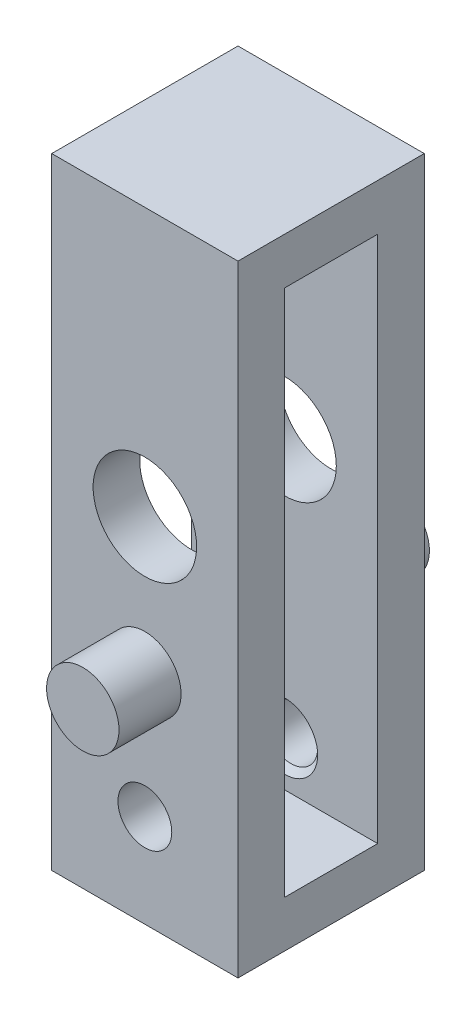
ISO-10303-21;
HEADER;
FILE_DESCRIPTION(('STEP AP214'),'2;1');
FILE_NAME('part.step','',(''),(''),'','','');
FILE_SCHEMA(('AUTOMOTIVE_DESIGN { 1 0 10303 214 1 1 1 1 }'));
ENDSEC;
DATA;
#1=APPLICATION_CONTEXT('core data for automotive mechanical design processes');
#2=APPLICATION_PROTOCOL_DEFINITION('international standard','automotive_design',2000,#1);
#3=PRODUCT_CONTEXT('',#1,'mechanical');
#4=PRODUCT('Part','Part','',(#3));
#5=PRODUCT_RELATED_PRODUCT_CATEGORY('part','',(#4));
#6=PRODUCT_DEFINITION_FORMATION('','',#4);
#7=PRODUCT_DEFINITION_CONTEXT('part definition',#1,'design');
#8=PRODUCT_DEFINITION('design','',#6,#7);
#9=PRODUCT_DEFINITION_SHAPE('','',#8);
#10=(LENGTH_UNIT() NAMED_UNIT(*) SI_UNIT(.MILLI.,.METRE.));
#11=(NAMED_UNIT(*) PLANE_ANGLE_UNIT() SI_UNIT($,.RADIAN.));
#12=(NAMED_UNIT(*) SI_UNIT($,.STERADIAN.) SOLID_ANGLE_UNIT());
#13=UNCERTAINTY_MEASURE_WITH_UNIT(LENGTH_MEASURE(1.E-05),#10,'distance_accuracy_value','');
#14=(GEOMETRIC_REPRESENTATION_CONTEXT(3) GLOBAL_UNCERTAINTY_ASSIGNED_CONTEXT((#13)) GLOBAL_UNIT_ASSIGNED_CONTEXT((#10,
#11,#12)) REPRESENTATION_CONTEXT('',''));
#15=CARTESIAN_POINT('',(0.,0.,0.));
#16=DIRECTION('',(0.,0.,1.));
#17=DIRECTION('',(1.,0.,0.));
#18=AXIS2_PLACEMENT_3D('',#15,#16,#17);
#19=CARTESIAN_POINT('',(45.,300.,45.));
#20=DIRECTION('',(-1.,0.,0.));
#21=DIRECTION('',(0.,0.,1.));
#22=AXIS2_PLACEMENT_3D('',#19,#20,#21);
#23=PLANE('',#22);
#24=DIRECTION('',(0.,0.,-1.));
#25=VECTOR('',#24,1.);
#26=CARTESIAN_POINT('',(45.,22.5,22.5));
#27=LINE('',#26,#25);
#28=CARTESIAN_POINT('',(45.,22.5,22.5));
#29=VERTEX_POINT('',#28);
#30=CARTESIAN_POINT('',(45.,22.5,-22.5));
#31=VERTEX_POINT('',#30);
#32=EDGE_CURVE('E145',#29,#31,#27,.T.);
#33=ORIENTED_EDGE('',*,*,#32,.F.);
#34=DIRECTION('',(0.,-1.,0.));
#35=VECTOR('',#34,1.);
#36=CARTESIAN_POINT('',(45.,277.5,22.5));
#37=LINE('',#36,#35);
#38=CARTESIAN_POINT('',(45.,277.5,22.5));
#39=VERTEX_POINT('',#38);
#40=EDGE_CURVE('E58',#39,#29,#37,.T.);
#41=ORIENTED_EDGE('',*,*,#40,.F.);
#42=DIRECTION('',(0.,0.,1.));
#43=VECTOR('',#42,1.);
#44=CARTESIAN_POINT('',(45.,277.5,-22.5));
#45=LINE('',#44,#43);
#46=CARTESIAN_POINT('',(45.,277.5,-22.5));
#47=VERTEX_POINT('',#46);
#48=EDGE_CURVE('E129',#47,#39,#45,.T.);
#49=ORIENTED_EDGE('',*,*,#48,.F.);
#50=DIRECTION('',(0.,1.,0.));
#51=VECTOR('',#50,1.);
#52=CARTESIAN_POINT('',(45.,22.5,-22.5));
#53=LINE('',#52,#51);
#54=EDGE_CURVE('E133',#31,#47,#53,.T.);
#55=ORIENTED_EDGE('',*,*,#54,.F.);
#56=EDGE_LOOP('',(#33,#41,#49,#55));
#57=FACE_BOUND('',#56,.T.);
#58=DIRECTION('',(0.,0.,-1.));
#59=VECTOR('',#58,1.);
#60=CARTESIAN_POINT('',(45.,0.,45.));
#61=LINE('',#60,#59);
#62=CARTESIAN_POINT('',(45.,0.,45.));
#63=VERTEX_POINT('',#62);
#64=CARTESIAN_POINT('',(45.,0.,-45.));
#65=VERTEX_POINT('',#64);
#66=EDGE_CURVE('E154',#63,#65,#61,.T.);
#67=ORIENTED_EDGE('',*,*,#66,.T.);
#68=DIRECTION('',(0.,-1.,0.));
#69=VECTOR('',#68,1.);
#70=CARTESIAN_POINT('',(45.,300.,-45.));
#71=LINE('',#70,#69);
#72=CARTESIAN_POINT('',(45.,300.,-45.));
#73=VERTEX_POINT('',#72);
#74=EDGE_CURVE('E197',#73,#65,#71,.T.);
#75=ORIENTED_EDGE('',*,*,#74,.F.);
#76=DIRECTION('',(0.,0.,-1.));
#77=VECTOR('',#76,1.);
#78=CARTESIAN_POINT('',(45.,300.,45.));
#79=LINE('',#78,#77);
#80=CARTESIAN_POINT('',(45.,300.,45.));
#81=VERTEX_POINT('',#80);
#82=EDGE_CURVE('E160',#81,#73,#79,.T.);
#83=ORIENTED_EDGE('',*,*,#82,.F.);
#84=DIRECTION('',(0.,-1.,0.));
#85=VECTOR('',#84,1.);
#86=CARTESIAN_POINT('',(45.,300.,45.));
#87=LINE('',#86,#85);
#88=EDGE_CURVE('E174',#81,#63,#87,.T.);
#89=ORIENTED_EDGE('',*,*,#88,.T.);
#90=EDGE_LOOP('',(#67,#75,#83,#89));
#91=FACE_BOUND('',#90,.T.);
#92=ADVANCED_FACE('F41',(#57,#91),#23,.F.);
#93=CARTESIAN_POINT('',(-45.,300.,-45.));
#94=DIRECTION('',(0.,0.,1.));
#95=DIRECTION('',(1.,0.,0.));
#96=AXIS2_PLACEMENT_3D('',#93,#94,#95);
#97=PLANE('',#96);
#98=CARTESIAN_POINT('',(0.,105.,-45.));
#99=DIRECTION('',(0.,0.,1.));
#100=DIRECTION('',(1.,0.,0.));
#101=AXIS2_PLACEMENT_3D('',#98,#99,#100);
#102=CIRCLE('',#101,17.5);
#103=CARTESIAN_POINT('',(17.5,105.,-45.));
#104=VERTEX_POINT('',#103);
#105=EDGE_CURVE('E300',#104,#104,#102,.T.);
#106=ORIENTED_EDGE('',*,*,#105,.T.);
#107=EDGE_LOOP('',(#106));
#108=FACE_BOUND('',#107,.T.);
#109=CARTESIAN_POINT('',(0.,45.,-45.));
#110=DIRECTION('',(0.,0.,1.));
#111=DIRECTION('',(1.,0.,0.));
#112=AXIS2_PLACEMENT_3D('',#109,#110,#111);
#113=CIRCLE('',#112,13.);
#114=CARTESIAN_POINT('',(13.,45.,-45.));
#115=VERTEX_POINT('',#114);
#116=EDGE_CURVE('E285',#115,#115,#113,.T.);
#117=ORIENTED_EDGE('',*,*,#116,.T.);
#118=EDGE_LOOP('',(#117));
#119=FACE_BOUND('',#118,.T.);
#120=CARTESIAN_POINT('',(0.,170.5,-45.));
#121=DIRECTION('',(0.,0.,1.));
#122=DIRECTION('',(1.,0.,0.));
#123=AXIS2_PLACEMENT_3D('',#120,#121,#122);
#124=CIRCLE('',#123,25.);
#125=CARTESIAN_POINT('',(25.,170.5,-45.));
#126=VERTEX_POINT('',#125);
#127=EDGE_CURVE('E206',#126,#126,#124,.T.);
#128=ORIENTED_EDGE('',*,*,#127,.T.);
#129=EDGE_LOOP('',(#128));
#130=FACE_BOUND('',#129,.T.);
#131=DIRECTION('',(-1.,0.,0.));
#132=VECTOR('',#131,1.);
#133=CARTESIAN_POINT('',(-45.,0.,-45.));
#134=LINE('',#133,#132);
#135=CARTESIAN_POINT('',(-45.,0.,-45.));
#136=VERTEX_POINT('',#135);
#137=EDGE_CURVE('E178',#65,#136,#134,.T.);
#138=ORIENTED_EDGE('',*,*,#137,.T.);
#139=DIRECTION('',(0.,-1.,0.));
#140=VECTOR('',#139,1.);
#141=CARTESIAN_POINT('',(-45.,300.,-45.));
#142=LINE('',#141,#140);
#143=CARTESIAN_POINT('',(-45.,300.,-45.));
#144=VERTEX_POINT('',#143);
#145=EDGE_CURVE('E193',#144,#136,#142,.T.);
#146=ORIENTED_EDGE('',*,*,#145,.F.);
#147=DIRECTION('',(-1.,0.,0.));
#148=VECTOR('',#147,1.);
#149=CARTESIAN_POINT('',(-45.,300.,-45.));
#150=LINE('',#149,#148);
#151=EDGE_CURVE('E164',#73,#144,#150,.T.);
#152=ORIENTED_EDGE('',*,*,#151,.F.);
#153=ORIENTED_EDGE('',*,*,#74,.T.);
#154=EDGE_LOOP('',(#138,#146,#152,#153));
#155=FACE_BOUND('',#154,.T.);
#156=ADVANCED_FACE('F251',(#108,#119,#130,#155),#97,.F.);
#157=CARTESIAN_POINT('',(-45.,300.,45.));
#158=DIRECTION('',(1.,0.,0.));
#159=DIRECTION('',(0.,0.,-1.));
#160=AXIS2_PLACEMENT_3D('',#157,#158,#159);
#161=PLANE('',#160);
#162=DIRECTION('',(0.,0.,1.));
#163=VECTOR('',#162,1.);
#164=CARTESIAN_POINT('',(-45.,277.5,-22.5));
#165=LINE('',#164,#163);
#166=CARTESIAN_POINT('',(-45.,277.5,-22.5));
#167=VERTEX_POINT('',#166);
#168=CARTESIAN_POINT('',(-45.,277.5,22.5));
#169=VERTEX_POINT('',#168);
#170=EDGE_CURVE('E117',#167,#169,#165,.T.);
#171=ORIENTED_EDGE('',*,*,#170,.T.);
#172=DIRECTION('',(0.,-1.,0.));
#173=VECTOR('',#172,1.);
#174=CARTESIAN_POINT('',(-45.,277.5,22.5));
#175=LINE('',#174,#173);
#176=CARTESIAN_POINT('',(-45.,22.5,22.5));
#177=VERTEX_POINT('',#176);
#178=EDGE_CURVE('E110',#169,#177,#175,.T.);
#179=ORIENTED_EDGE('',*,*,#178,.T.);
#180=DIRECTION('',(0.,0.,-1.));
#181=VECTOR('',#180,1.);
#182=CARTESIAN_POINT('',(-45.,22.5,22.5));
#183=LINE('',#182,#181);
#184=CARTESIAN_POINT('',(-45.,22.5,-22.5));
#185=VERTEX_POINT('',#184);
#186=EDGE_CURVE('E120',#177,#185,#183,.T.);
#187=ORIENTED_EDGE('',*,*,#186,.T.);
#188=DIRECTION('',(0.,1.,0.));
#189=VECTOR('',#188,1.);
#190=CARTESIAN_POINT('',(-45.,22.5,-22.5));
#191=LINE('',#190,#189);
#192=EDGE_CURVE('E66',#185,#167,#191,.T.);
#193=ORIENTED_EDGE('',*,*,#192,.T.);
#194=EDGE_LOOP('',(#171,#179,#187,#193));
#195=FACE_BOUND('',#194,.T.);
#196=DIRECTION('',(0.,0.,1.));
#197=VECTOR('',#196,1.);
#198=CARTESIAN_POINT('',(-45.,0.,45.));
#199=LINE('',#198,#197);
#200=CARTESIAN_POINT('',(-45.,0.,45.));
#201=VERTEX_POINT('',#200);
#202=EDGE_CURVE('E181',#136,#201,#199,.T.);
#203=ORIENTED_EDGE('',*,*,#202,.T.);
#204=DIRECTION('',(0.,-1.,0.));
#205=VECTOR('',#204,1.);
#206=CARTESIAN_POINT('',(-45.,300.,45.));
#207=LINE('',#206,#205);
#208=CARTESIAN_POINT('',(-45.,300.,45.));
#209=VERTEX_POINT('',#208);
#210=EDGE_CURVE('E189',#209,#201,#207,.T.);
#211=ORIENTED_EDGE('',*,*,#210,.F.);
#212=DIRECTION('',(0.,0.,1.));
#213=VECTOR('',#212,1.);
#214=CARTESIAN_POINT('',(-45.,300.,45.));
#215=LINE('',#214,#213);
#216=EDGE_CURVE('E168',#144,#209,#215,.T.);
#217=ORIENTED_EDGE('',*,*,#216,.F.);
#218=ORIENTED_EDGE('',*,*,#145,.T.);
#219=EDGE_LOOP('',(#203,#211,#217,#218));
#220=FACE_BOUND('',#219,.T.);
#221=ADVANCED_FACE('F125',(#195,#220),#161,.F.);
#222=CARTESIAN_POINT('',(-45.,300.,45.));
#223=DIRECTION('',(0.,0.,-1.));
#224=DIRECTION('',(-1.,0.,0.));
#225=AXIS2_PLACEMENT_3D('',#222,#223,#224);
#226=PLANE('',#225);
#227=CARTESIAN_POINT('',(0.,105.,45.));
#228=DIRECTION('',(0.,0.,-1.));
#229=DIRECTION('',(-1.,0.,0.));
#230=AXIS2_PLACEMENT_3D('',#227,#228,#229);
#231=CIRCLE('',#230,17.5);
#232=CARTESIAN_POINT('',(-17.5,105.,45.));
#233=VERTEX_POINT('',#232);
#234=EDGE_CURVE('E11',#233,#233,#231,.F.);
#235=ORIENTED_EDGE('',*,*,#234,.F.);
#236=EDGE_LOOP('',(#235));
#237=FACE_BOUND('',#236,.T.);
#238=CARTESIAN_POINT('',(0.,45.,45.));
#239=DIRECTION('',(0.,0.,1.));
#240=DIRECTION('',(1.,0.,0.));
#241=AXIS2_PLACEMENT_3D('',#238,#239,#240);
#242=CIRCLE('',#241,13.);
#243=CARTESIAN_POINT('',(13.,45.,45.));
#244=VERTEX_POINT('',#243);
#245=EDGE_CURVE('E288',#244,#244,#242,.T.);
#246=ORIENTED_EDGE('',*,*,#245,.F.);
#247=EDGE_LOOP('',(#246));
#248=FACE_BOUND('',#247,.T.);
#249=CARTESIAN_POINT('',(0.,170.5,45.));
#250=DIRECTION('',(0.,0.,1.));
#251=DIRECTION('',(1.,0.,0.));
#252=AXIS2_PLACEMENT_3D('',#249,#250,#251);
#253=CIRCLE('',#252,25.);
#254=CARTESIAN_POINT('',(25.,170.5,45.));
#255=VERTEX_POINT('',#254);
#256=EDGE_CURVE('E281',#255,#255,#253,.T.);
#257=ORIENTED_EDGE('',*,*,#256,.F.);
#258=EDGE_LOOP('',(#257));
#259=FACE_BOUND('',#258,.T.);
#260=DIRECTION('',(1.,0.,0.));
#261=VECTOR('',#260,1.);
#262=CARTESIAN_POINT('',(-45.,0.,45.));
#263=LINE('',#262,#261);
#264=EDGE_CURVE('E165',#201,#63,#263,.T.);
#265=ORIENTED_EDGE('',*,*,#264,.T.);
#266=ORIENTED_EDGE('',*,*,#88,.F.);
#267=DIRECTION('',(1.,0.,0.));
#268=VECTOR('',#267,1.);
#269=CARTESIAN_POINT('',(-45.,300.,45.));
#270=LINE('',#269,#268);
#271=EDGE_CURVE('E171',#209,#81,#270,.T.);
#272=ORIENTED_EDGE('',*,*,#271,.F.);
#273=ORIENTED_EDGE('',*,*,#210,.T.);
#274=EDGE_LOOP('',(#265,#266,#272,#273));
#275=FACE_BOUND('',#274,.T.);
#276=ADVANCED_FACE('F335',(#237,#248,#259,#275),#226,.F.);
#277=CARTESIAN_POINT('',(0.,300.,0.));
#278=DIRECTION('',(0.,-1.,0.));
#279=DIRECTION('',(0.,0.,-1.));
#280=AXIS2_PLACEMENT_3D('',#277,#278,#279);
#281=PLANE('',#280);
#282=ORIENTED_EDGE('',*,*,#82,.T.);
#283=ORIENTED_EDGE('',*,*,#151,.T.);
#284=ORIENTED_EDGE('',*,*,#216,.T.);
#285=ORIENTED_EDGE('',*,*,#271,.T.);
#286=EDGE_LOOP('',(#282,#283,#284,#285));
#287=FACE_BOUND('',#286,.T.);
#288=ADVANCED_FACE('F338',(#287),#281,.F.);
#289=CARTESIAN_POINT('',(0.,0.,0.));
#290=DIRECTION('',(0.,-1.,0.));
#291=DIRECTION('',(0.,0.,-1.));
#292=AXIS2_PLACEMENT_3D('',#289,#290,#291);
#293=PLANE('',#292);
#294=ORIENTED_EDGE('',*,*,#66,.F.);
#295=ORIENTED_EDGE('',*,*,#264,.F.);
#296=ORIENTED_EDGE('',*,*,#202,.F.);
#297=ORIENTED_EDGE('',*,*,#137,.F.);
#298=EDGE_LOOP('',(#294,#295,#296,#297));
#299=FACE_BOUND('',#298,.T.);
#300=ADVANCED_FACE('F246',(#299),#293,.T.);
#301=CARTESIAN_POINT('',(-45.,277.5,22.5));
#302=DIRECTION('',(0.,0.,1.));
#303=DIRECTION('',(1.,0.,0.));
#304=AXIS2_PLACEMENT_3D('',#301,#302,#303);
#305=PLANE('',#304);
#306=CARTESIAN_POINT('',(0.,45.,22.5));
#307=DIRECTION('',(0.,0.,1.));
#308=DIRECTION('',(1.,0.,0.));
#309=AXIS2_PLACEMENT_3D('',#306,#307,#308);
#310=CIRCLE('',#309,15.9999999999998);
#311=CARTESIAN_POINT('',(15.9999999999998,45.,22.5));
#312=VERTEX_POINT('',#311);
#313=EDGE_CURVE('E201',#312,#312,#310,.T.);
#314=ORIENTED_EDGE('',*,*,#313,.T.);
#315=EDGE_LOOP('',(#314));
#316=FACE_BOUND('',#315,.T.);
#317=CARTESIAN_POINT('',(0.,170.5,22.5));
#318=DIRECTION('',(0.,0.,1.));
#319=DIRECTION('',(1.,0.,0.));
#320=AXIS2_PLACEMENT_3D('',#317,#318,#319);
#321=CIRCLE('',#320,25.);
#322=CARTESIAN_POINT('',(25.,170.5,22.5));
#323=VERTEX_POINT('',#322);
#324=EDGE_CURVE('E136',#323,#323,#321,.T.);
#325=ORIENTED_EDGE('',*,*,#324,.T.);
#326=EDGE_LOOP('',(#325));
#327=FACE_BOUND('',#326,.T.);
#328=ORIENTED_EDGE('',*,*,#40,.T.);
#329=DIRECTION('',(1.,0.,0.));
#330=VECTOR('',#329,1.);
#331=CARTESIAN_POINT('',(-45.,22.5,22.5));
#332=LINE('',#331,#330);
#333=EDGE_CURVE('E106',#177,#29,#332,.T.);
#334=ORIENTED_EDGE('',*,*,#333,.F.);
#335=ORIENTED_EDGE('',*,*,#178,.F.);
#336=DIRECTION('',(1.,0.,0.));
#337=VECTOR('',#336,1.);
#338=CARTESIAN_POINT('',(-45.,277.5,22.5));
#339=LINE('',#338,#337);
#340=EDGE_CURVE('E151',#169,#39,#339,.T.);
#341=ORIENTED_EDGE('',*,*,#340,.T.);
#342=EDGE_LOOP('',(#328,#334,#335,#341));
#343=FACE_BOUND('',#342,.T.);
#344=ADVANCED_FACE('F108',(#316,#327,#343),#305,.F.);
#345=CARTESIAN_POINT('',(-45.,277.5,-22.5));
#346=DIRECTION('',(0.,1.,0.));
#347=DIRECTION('',(0.,0.,1.));
#348=AXIS2_PLACEMENT_3D('',#345,#346,#347);
#349=PLANE('',#348);
#350=ORIENTED_EDGE('',*,*,#48,.T.);
#351=ORIENTED_EDGE('',*,*,#340,.F.);
#352=ORIENTED_EDGE('',*,*,#170,.F.);
#353=DIRECTION('',(1.,0.,0.));
#354=VECTOR('',#353,1.);
#355=CARTESIAN_POINT('',(-45.,277.5,-22.5));
#356=LINE('',#355,#354);
#357=EDGE_CURVE('E155',#167,#47,#356,.T.);
#358=ORIENTED_EDGE('',*,*,#357,.T.);
#359=EDGE_LOOP('',(#350,#351,#352,#358));
#360=FACE_BOUND('',#359,.T.);
#361=ADVANCED_FACE('F233',(#360),#349,.F.);
#362=CARTESIAN_POINT('',(-45.,22.5,-22.5));
#363=DIRECTION('',(0.,0.,-1.));
#364=DIRECTION('',(-1.,0.,0.));
#365=AXIS2_PLACEMENT_3D('',#362,#363,#364);
#366=PLANE('',#365);
#367=CARTESIAN_POINT('',(0.,45.,-22.5));
#368=DIRECTION('',(0.,0.,-1.));
#369=DIRECTION('',(-1.,0.,0.));
#370=AXIS2_PLACEMENT_3D('',#367,#368,#369);
#371=CIRCLE('',#370,15.9999999999998);
#372=CARTESIAN_POINT('',(15.9999999999999,45.,-22.5));
#373=VERTEX_POINT('',#372);
#374=EDGE_CURVE('E214',#373,#373,#371,.T.);
#375=ORIENTED_EDGE('',*,*,#374,.T.);
#376=EDGE_LOOP('',(#375));
#377=FACE_BOUND('',#376,.T.);
#378=CARTESIAN_POINT('',(0.,170.5,-22.5));
#379=DIRECTION('',(0.,0.,-1.));
#380=DIRECTION('',(-1.,0.,0.));
#381=AXIS2_PLACEMENT_3D('',#378,#379,#380);
#382=CIRCLE('',#381,25.);
#383=CARTESIAN_POINT('',(25.,170.5,-22.5));
#384=VERTEX_POINT('',#383);
#385=EDGE_CURVE('E202',#384,#384,#382,.T.);
#386=ORIENTED_EDGE('',*,*,#385,.T.);
#387=EDGE_LOOP('',(#386));
#388=FACE_BOUND('',#387,.T.);
#389=ORIENTED_EDGE('',*,*,#54,.T.);
#390=ORIENTED_EDGE('',*,*,#357,.F.);
#391=ORIENTED_EDGE('',*,*,#192,.F.);
#392=DIRECTION('',(1.,0.,0.));
#393=VECTOR('',#392,1.);
#394=CARTESIAN_POINT('',(-45.,22.5,-22.5));
#395=LINE('',#394,#393);
#396=EDGE_CURVE('E116',#185,#31,#395,.T.);
#397=ORIENTED_EDGE('',*,*,#396,.T.);
#398=EDGE_LOOP('',(#389,#390,#391,#397));
#399=FACE_BOUND('',#398,.T.);
#400=ADVANCED_FACE('F230',(#377,#388,#399),#366,.F.);
#401=CARTESIAN_POINT('',(-45.,22.5,22.5));
#402=DIRECTION('',(0.,-1.,0.));
#403=DIRECTION('',(0.,0.,-1.));
#404=AXIS2_PLACEMENT_3D('',#401,#402,#403);
#405=PLANE('',#404);
#406=ORIENTED_EDGE('',*,*,#32,.T.);
#407=ORIENTED_EDGE('',*,*,#396,.F.);
#408=ORIENTED_EDGE('',*,*,#186,.F.);
#409=ORIENTED_EDGE('',*,*,#333,.T.);
#410=EDGE_LOOP('',(#406,#407,#408,#409));
#411=FACE_BOUND('',#410,.T.);
#412=ADVANCED_FACE('F121',(#411),#405,.F.);
#413=CARTESIAN_POINT('',(0.,170.5,-45.));
#414=DIRECTION('',(0.,0.,1.));
#415=DIRECTION('',(1.,0.,0.));
#416=AXIS2_PLACEMENT_3D('',#413,#414,#415);
#417=CYLINDRICAL_SURFACE('',#416,25.);
#418=CARTESIAN_POINT('',(25.,170.5,-45.));
#419=CARTESIAN_POINT('',(25.,170.5,-44.765625));
#420=CARTESIAN_POINT('',(25.,170.5,-44.53125));
#421=CARTESIAN_POINT('',(25.,170.5,-44.0625));
#422=CARTESIAN_POINT('',(25.,170.5,-43.828125));
#423=CARTESIAN_POINT('',(25.,170.5,-43.359375));
#424=CARTESIAN_POINT('',(25.,170.5,-43.125));
#425=CARTESIAN_POINT('',(25.,170.5,-42.65625));
#426=CARTESIAN_POINT('',(25.,170.5,-42.421875));
#427=CARTESIAN_POINT('',(25.,170.5,-41.953125));
#428=CARTESIAN_POINT('',(25.,170.5,-41.71875));
#429=CARTESIAN_POINT('',(25.,170.5,-41.25));
#430=CARTESIAN_POINT('',(25.,170.5,-41.015625));
#431=CARTESIAN_POINT('',(25.,170.5,-40.546875));
#432=CARTESIAN_POINT('',(25.,170.5,-40.3125));
#433=CARTESIAN_POINT('',(25.,170.5,-39.84375));
#434=CARTESIAN_POINT('',(25.,170.5,-39.609375));
#435=CARTESIAN_POINT('',(25.,170.5,-39.140625));
#436=CARTESIAN_POINT('',(25.,170.5,-38.90625));
#437=CARTESIAN_POINT('',(25.,170.5,-38.4375));
#438=CARTESIAN_POINT('',(25.,170.5,-38.203125));
#439=CARTESIAN_POINT('',(25.,170.5,-37.734375));
#440=CARTESIAN_POINT('',(25.,170.5,-37.5));
#441=CARTESIAN_POINT('',(25.,170.5,-37.03125));
#442=CARTESIAN_POINT('',(25.,170.5,-36.796875));
#443=CARTESIAN_POINT('',(25.,170.5,-36.328125));
#444=CARTESIAN_POINT('',(25.,170.5,-36.09375));
#445=CARTESIAN_POINT('',(25.,170.5,-35.625));
#446=CARTESIAN_POINT('',(25.,170.5,-35.390625));
#447=CARTESIAN_POINT('',(25.,170.5,-34.921875));
#448=CARTESIAN_POINT('',(25.,170.5,-34.6875));
#449=CARTESIAN_POINT('',(25.,170.5,-34.21875));
#450=CARTESIAN_POINT('',(25.,170.5,-33.984375));
#451=CARTESIAN_POINT('',(25.,170.5,-33.515625));
#452=CARTESIAN_POINT('',(25.,170.5,-33.28125));
#453=CARTESIAN_POINT('',(25.,170.5,-32.8125));
#454=CARTESIAN_POINT('',(25.,170.5,-32.578125));
#455=CARTESIAN_POINT('',(25.,170.5,-32.109375));
#456=CARTESIAN_POINT('',(25.,170.5,-31.875));
#457=CARTESIAN_POINT('',(25.,170.5,-31.40625));
#458=CARTESIAN_POINT('',(25.,170.5,-31.171875));
#459=CARTESIAN_POINT('',(25.,170.5,-30.703125));
#460=CARTESIAN_POINT('',(25.,170.5,-30.46875));
#461=CARTESIAN_POINT('',(25.,170.5,-30.));
#462=CARTESIAN_POINT('',(25.,170.5,-29.765625));
#463=CARTESIAN_POINT('',(25.,170.5,-29.296875));
#464=CARTESIAN_POINT('',(25.,170.5,-29.0625));
#465=CARTESIAN_POINT('',(25.,170.5,-28.59375));
#466=CARTESIAN_POINT('',(25.,170.5,-28.359375));
#467=CARTESIAN_POINT('',(25.,170.5,-27.890625));
#468=CARTESIAN_POINT('',(25.,170.5,-27.65625));
#469=CARTESIAN_POINT('',(25.,170.5,-27.1875));
#470=CARTESIAN_POINT('',(25.,170.5,-26.953125));
#471=CARTESIAN_POINT('',(25.,170.5,-26.484375));
#472=CARTESIAN_POINT('',(25.,170.5,-26.25));
#473=CARTESIAN_POINT('',(25.,170.5,-25.78125));
#474=CARTESIAN_POINT('',(25.,170.5,-25.546875));
#475=CARTESIAN_POINT('',(25.,170.5,-25.078125));
#476=CARTESIAN_POINT('',(25.,170.5,-24.84375));
#477=CARTESIAN_POINT('',(25.,170.5,-24.375));
#478=CARTESIAN_POINT('',(25.,170.5,-24.140625));
#479=CARTESIAN_POINT('',(25.,170.5,-23.671875));
#480=CARTESIAN_POINT('',(25.,170.5,-23.4375));
#481=CARTESIAN_POINT('',(25.,170.5,-22.96875));
#482=CARTESIAN_POINT('',(25.,170.5,-22.734375));
#483=CARTESIAN_POINT('',(25.,170.5,-22.5));
#484=B_SPLINE_CURVE_WITH_KNOTS('',3,(#418,#419,#420,#421,#422,#423,#424,#425,#426,#427,#428,
#429,#430,#431,#432,#433,#434,#435,#436,#437,#438,#439,#440,#441,#442,#443,#444,#445,#446,#447,
#448,#449,#450,#451,#452,#453,#454,#455,#456,#457,#458,#459,#460,#461,#462,#463,#464,#465,#466,
#467,#468,#469,#470,#471,#472,#473,#474,#475,#476,#477,#478,#479,#480,#481,#482,#483),
.UNSPECIFIED.,.F.,.F.,(4,2,2,2,2,2,2,2,2,2,2,2,2,2,2,2,2,2,2,2,2,2,2,2,2,2,2,2,2,2,2,2,4),(0.,
0.703124999999999,1.40625,2.109375,2.8125,3.51562499999999,4.21875,4.921875,5.625,6.328125,
7.03125,7.734375,8.4375,9.140625,9.84375,10.546875,11.25,11.953125,12.65625,13.359375,14.0625,
14.765625,15.46875,16.171875,16.875,17.578125,18.28125,18.984375,19.6875,20.390625,21.09375,
21.796875,22.5),.UNSPECIFIED.);
#485=EDGE_CURVE('BSEAM326',#126,#384,#484,.T.);
#486=ORIENTED_EDGE('',*,*,#127,.F.);
#487=ORIENTED_EDGE('',*,*,#385,.F.);
#488=ORIENTED_EDGE('',*,*,#485,.T.);
#489=ORIENTED_EDGE('',*,*,#485,.F.);
#490=EDGE_LOOP('',(#486,#488,#487,#489));
#491=FACE_BOUND('',#490,.T.);
#492=ADVANCED_FACE('F326',(#491),#417,.F.);
#493=CARTESIAN_POINT('',(25.,170.5,45.));
#494=CARTESIAN_POINT('',(25.,170.5,44.765625));
#495=CARTESIAN_POINT('',(25.,170.5,44.53125));
#496=CARTESIAN_POINT('',(25.,170.5,44.0625));
#497=CARTESIAN_POINT('',(25.,170.5,43.828125));
#498=CARTESIAN_POINT('',(25.,170.5,43.359375));
#499=CARTESIAN_POINT('',(25.,170.5,43.125));
#500=CARTESIAN_POINT('',(25.,170.5,42.65625));
#501=CARTESIAN_POINT('',(25.,170.5,42.421875));
#502=CARTESIAN_POINT('',(25.,170.5,41.953125));
#503=CARTESIAN_POINT('',(25.,170.5,41.71875));
#504=CARTESIAN_POINT('',(25.,170.5,41.25));
#505=CARTESIAN_POINT('',(25.,170.5,41.015625));
#506=CARTESIAN_POINT('',(25.,170.5,40.546875));
#507=CARTESIAN_POINT('',(25.,170.5,40.3125));
#508=CARTESIAN_POINT('',(25.,170.5,39.84375));
#509=CARTESIAN_POINT('',(25.,170.5,39.609375));
#510=CARTESIAN_POINT('',(25.,170.5,39.140625));
#511=CARTESIAN_POINT('',(25.,170.5,38.90625));
#512=CARTESIAN_POINT('',(25.,170.5,38.4375));
#513=CARTESIAN_POINT('',(25.,170.5,38.203125));
#514=CARTESIAN_POINT('',(25.,170.5,37.734375));
#515=CARTESIAN_POINT('',(25.,170.5,37.5));
#516=CARTESIAN_POINT('',(25.,170.5,37.03125));
#517=CARTESIAN_POINT('',(25.,170.5,36.796875));
#518=CARTESIAN_POINT('',(25.,170.5,36.328125));
#519=CARTESIAN_POINT('',(25.,170.5,36.09375));
#520=CARTESIAN_POINT('',(25.,170.5,35.625));
#521=CARTESIAN_POINT('',(25.,170.5,35.390625));
#522=CARTESIAN_POINT('',(25.,170.5,34.921875));
#523=CARTESIAN_POINT('',(25.,170.5,34.6875));
#524=CARTESIAN_POINT('',(25.,170.5,34.21875));
#525=CARTESIAN_POINT('',(25.,170.5,33.984375));
#526=CARTESIAN_POINT('',(25.,170.5,33.515625));
#527=CARTESIAN_POINT('',(25.,170.5,33.28125));
#528=CARTESIAN_POINT('',(25.,170.5,32.8125));
#529=CARTESIAN_POINT('',(25.,170.5,32.578125));
#530=CARTESIAN_POINT('',(25.,170.5,32.109375));
#531=CARTESIAN_POINT('',(25.,170.5,31.875));
#532=CARTESIAN_POINT('',(25.,170.5,31.40625));
#533=CARTESIAN_POINT('',(25.,170.5,31.171875));
#534=CARTESIAN_POINT('',(25.,170.5,30.703125));
#535=CARTESIAN_POINT('',(25.,170.5,30.46875));
#536=CARTESIAN_POINT('',(25.,170.5,30.));
#537=CARTESIAN_POINT('',(25.,170.5,29.765625));
#538=CARTESIAN_POINT('',(25.,170.5,29.296875));
#539=CARTESIAN_POINT('',(25.,170.5,29.0625));
#540=CARTESIAN_POINT('',(25.,170.5,28.59375));
#541=CARTESIAN_POINT('',(25.,170.5,28.359375));
#542=CARTESIAN_POINT('',(25.,170.5,27.890625));
#543=CARTESIAN_POINT('',(25.,170.5,27.65625));
#544=CARTESIAN_POINT('',(25.,170.5,27.1875));
#545=CARTESIAN_POINT('',(25.,170.5,26.953125));
#546=CARTESIAN_POINT('',(25.,170.5,26.484375));
#547=CARTESIAN_POINT('',(25.,170.5,26.25));
#548=CARTESIAN_POINT('',(25.,170.5,25.78125));
#549=CARTESIAN_POINT('',(25.,170.5,25.546875));
#550=CARTESIAN_POINT('',(25.,170.5,25.078125));
#551=CARTESIAN_POINT('',(25.,170.5,24.84375));
#552=CARTESIAN_POINT('',(25.,170.5,24.375));
#553=CARTESIAN_POINT('',(25.,170.5,24.140625));
#554=CARTESIAN_POINT('',(25.,170.5,23.671875));
#555=CARTESIAN_POINT('',(25.,170.5,23.4375));
#556=CARTESIAN_POINT('',(25.,170.5,22.96875));
#557=CARTESIAN_POINT('',(25.,170.5,22.734375));
#558=CARTESIAN_POINT('',(25.,170.5,22.5));
#559=B_SPLINE_CURVE_WITH_KNOTS('',3,(#493,#494,#495,#496,#497,#498,#499,#500,#501,#502,#503,
#504,#505,#506,#507,#508,#509,#510,#511,#512,#513,#514,#515,#516,#517,#518,#519,#520,#521,#522,
#523,#524,#525,#526,#527,#528,#529,#530,#531,#532,#533,#534,#535,#536,#537,#538,#539,#540,#541,
#542,#543,#544,#545,#546,#547,#548,#549,#550,#551,#552,#553,#554,#555,#556,#557,#558),
.UNSPECIFIED.,.F.,.F.,(4,2,2,2,2,2,2,2,2,2,2,2,2,2,2,2,2,2,2,2,2,2,2,2,2,2,2,2,2,2,2,2,4),(0.,
0.703124999999999,1.40625,2.109375,2.8125,3.51562499999999,4.21874999999999,4.92187499999999,
5.62499999999999,6.328125,7.03125,7.734375,8.4375,9.140625,9.84375,10.546875,11.25,11.953125,
12.65625,13.359375,14.0625,14.765625,15.46875,16.171875,16.875,17.578125,18.28125,18.984375,
19.6875,20.390625,21.09375,21.796875,22.5),.UNSPECIFIED.);
#560=EDGE_CURVE('BSEAM324',#255,#323,#559,.T.);
#561=ORIENTED_EDGE('',*,*,#256,.T.);
#562=ORIENTED_EDGE('',*,*,#324,.F.);
#563=ORIENTED_EDGE('',*,*,#560,.T.);
#564=ORIENTED_EDGE('',*,*,#560,.F.);
#565=EDGE_LOOP('',(#561,#563,#562,#564));
#566=FACE_BOUND('',#565,.T.);
#567=ADVANCED_FACE('F324',(#566),#417,.F.);
#568=CARTESIAN_POINT('',(0.,45.,-45.));
#569=DIRECTION('',(0.,0.,1.));
#570=DIRECTION('',(1.,0.,0.));
#571=AXIS2_PLACEMENT_3D('',#568,#569,#570);
#572=CYLINDRICAL_SURFACE('',#571,13.);
#573=CARTESIAN_POINT('',(0.,45.,-25.4999999999999));
#574=DIRECTION('',(0.,0.,-1.));
#575=DIRECTION('',(-1.,0.,0.));
#576=AXIS2_PLACEMENT_3D('',#573,#574,#575);
#577=CIRCLE('',#576,13.);
#578=CARTESIAN_POINT('',(13.,45.,-25.4999999999999));
#579=VERTEX_POINT('',#578);
#580=EDGE_CURVE('E51',#579,#579,#577,.F.);
#581=CARTESIAN_POINT('',(13.,45.,-25.4999999999999));
#582=CARTESIAN_POINT('',(13.,45.,-25.7031249999999));
#583=CARTESIAN_POINT('',(13.,45.,-25.9062499999999));
#584=CARTESIAN_POINT('',(13.,45.,-26.3124999999999));
#585=CARTESIAN_POINT('',(13.,45.,-26.5156249999999));
#586=CARTESIAN_POINT('',(13.,45.,-26.9218749999999));
#587=CARTESIAN_POINT('',(13.,45.,-27.1249999999999));
#588=CARTESIAN_POINT('',(13.,45.,-27.5312499999999));
#589=CARTESIAN_POINT('',(13.,45.,-27.7343749999999));
#590=CARTESIAN_POINT('',(13.,45.,-28.1406249999999));
#591=CARTESIAN_POINT('',(13.,45.,-28.3437499999999));
#592=CARTESIAN_POINT('',(13.,45.,-28.7499999999999));
#593=CARTESIAN_POINT('',(13.,45.,-28.9531249999999));
#594=CARTESIAN_POINT('',(13.,45.,-29.3593749999999));
#595=CARTESIAN_POINT('',(13.,45.,-29.5624999999999));
#596=CARTESIAN_POINT('',(13.,45.,-29.9687499999999));
#597=CARTESIAN_POINT('',(13.,45.,-30.1718749999999));
#598=CARTESIAN_POINT('',(13.,45.,-30.5781249999999));
#599=CARTESIAN_POINT('',(13.,45.,-30.7812499999999));
#600=CARTESIAN_POINT('',(13.,45.,-31.1874999999999));
#601=CARTESIAN_POINT('',(13.,45.,-31.3906249999999));
#602=CARTESIAN_POINT('',(13.,45.,-31.7968749999999));
#603=CARTESIAN_POINT('',(13.,45.,-31.9999999999999));
#604=CARTESIAN_POINT('',(13.,45.,-32.4062499999999));
#605=CARTESIAN_POINT('',(13.,45.,-32.6093749999999));
#606=CARTESIAN_POINT('',(13.,45.,-33.0156249999999));
#607=CARTESIAN_POINT('',(13.,45.,-33.2187499999999));
#608=CARTESIAN_POINT('',(13.,45.,-33.6249999999999));
#609=CARTESIAN_POINT('',(13.,45.,-33.8281249999999));
#610=CARTESIAN_POINT('',(13.,45.,-34.2343749999999));
#611=CARTESIAN_POINT('',(13.,45.,-34.4374999999999));
#612=CARTESIAN_POINT('',(13.,45.,-34.8437499999999));
#613=CARTESIAN_POINT('',(13.,45.,-35.0468749999999));
#614=CARTESIAN_POINT('',(13.,45.,-35.4531249999999));
#615=CARTESIAN_POINT('',(13.,45.,-35.6562499999999));
#616=CARTESIAN_POINT('',(13.,45.,-36.0624999999999));
#617=CARTESIAN_POINT('',(13.,45.,-36.265625));
#618=CARTESIAN_POINT('',(13.,45.,-36.6718749999999));
#619=CARTESIAN_POINT('',(13.,45.,-36.875));
#620=CARTESIAN_POINT('',(13.,45.,-37.28125));
#621=CARTESIAN_POINT('',(13.,45.,-37.484375));
#622=CARTESIAN_POINT('',(13.,45.,-37.890625));
#623=CARTESIAN_POINT('',(13.,45.,-38.09375));
#624=CARTESIAN_POINT('',(13.,45.,-38.5));
#625=CARTESIAN_POINT('',(13.,45.,-38.703125));
#626=CARTESIAN_POINT('',(13.,45.,-39.109375));
#627=CARTESIAN_POINT('',(13.,45.,-39.3125));
#628=CARTESIAN_POINT('',(13.,45.,-39.71875));
#629=CARTESIAN_POINT('',(13.,45.,-39.921875));
#630=CARTESIAN_POINT('',(13.,45.,-40.328125));
#631=CARTESIAN_POINT('',(13.,45.,-40.53125));
#632=CARTESIAN_POINT('',(13.,45.,-40.9375));
#633=CARTESIAN_POINT('',(13.,45.,-41.140625));
#634=CARTESIAN_POINT('',(13.,45.,-41.546875));
#635=CARTESIAN_POINT('',(13.,45.,-41.75));
#636=CARTESIAN_POINT('',(13.,45.,-42.15625));
#637=CARTESIAN_POINT('',(13.,45.,-42.359375));
#638=CARTESIAN_POINT('',(13.,45.,-42.765625));
#639=CARTESIAN_POINT('',(13.,45.,-42.96875));
#640=CARTESIAN_POINT('',(13.,45.,-43.375));
#641=CARTESIAN_POINT('',(13.,45.,-43.578125));
#642=CARTESIAN_POINT('',(13.,45.,-43.984375));
#643=CARTESIAN_POINT('',(13.,45.,-44.1875));
#644=CARTESIAN_POINT('',(13.,45.,-44.59375));
#645=CARTESIAN_POINT('',(13.,45.,-44.796875));
#646=CARTESIAN_POINT('',(13.,45.,-45.));
#647=B_SPLINE_CURVE_WITH_KNOTS('',3,(#581,#582,#583,#584,#585,#586,#587,#588,#589,#590,#591,
#592,#593,#594,#595,#596,#597,#598,#599,#600,#601,#602,#603,#604,#605,#606,#607,#608,#609,#610,
#611,#612,#613,#614,#615,#616,#617,#618,#619,#620,#621,#622,#623,#624,#625,#626,#627,#628,#629,
#630,#631,#632,#633,#634,#635,#636,#637,#638,#639,#640,#641,#642,#643,#644,#645,#646),
.UNSPECIFIED.,.F.,.F.,(4,2,2,2,2,2,2,2,2,2,2,2,2,2,2,2,2,2,2,2,2,2,2,2,2,2,2,2,2,2,2,2,4),(0.,
0.609375000000006,1.21875000000001,1.82812500000001,2.43750000000002,3.04687500000002,
3.65625000000003,4.26562500000003,4.87500000000004,5.48437500000004,6.09375000000004,
6.70312500000005,7.31250000000005,7.92187500000005,8.53125000000006,9.14062500000007,
9.75000000000007,10.3593750000001,10.9687500000001,11.5781250000001,12.1875000000001,
12.7968750000001,13.4062500000001,14.0156250000001,14.6250000000001,15.2343750000001,
15.8437500000001,16.4531250000001,17.0625000000001,17.6718750000001,18.2812500000001,
18.8906250000001,19.5000000000001),.UNSPECIFIED.);
#648=EDGE_CURVE('BSEAM221',#579,#115,#647,.T.);
#649=ORIENTED_EDGE('',*,*,#580,.T.);
#650=ORIENTED_EDGE('',*,*,#116,.F.);
#651=ORIENTED_EDGE('',*,*,#648,.T.);
#652=ORIENTED_EDGE('',*,*,#648,.F.);
#653=EDGE_LOOP('',(#649,#651,#650,#652));
#654=FACE_BOUND('',#653,.T.);
#655=ADVANCED_FACE('F221',(#654),#572,.F.);
#656=CARTESIAN_POINT('',(0.,45.,25.4999999999998));
#657=DIRECTION('',(0.,0.,1.));
#658=DIRECTION('',(1.,0.,0.));
#659=AXIS2_PLACEMENT_3D('',#656,#657,#658);
#660=CIRCLE('',#659,13.);
#661=CARTESIAN_POINT('',(13.,45.,25.4999999999998));
#662=VERTEX_POINT('',#661);
#663=EDGE_CURVE('E210',#662,#662,#660,.F.);
#664=CARTESIAN_POINT('',(13.,45.,25.4999999999998));
#665=CARTESIAN_POINT('',(13.,45.,25.7031249999998));
#666=CARTESIAN_POINT('',(13.,45.,25.9062499999998));
#667=CARTESIAN_POINT('',(13.,45.,26.3124999999998));
#668=CARTESIAN_POINT('',(13.,45.,26.5156249999998));
#669=CARTESIAN_POINT('',(13.,45.,26.9218749999998));
#670=CARTESIAN_POINT('',(13.,45.,27.1249999999998));
#671=CARTESIAN_POINT('',(13.,45.,27.5312499999998));
#672=CARTESIAN_POINT('',(13.,45.,27.7343749999998));
#673=CARTESIAN_POINT('',(13.,45.,28.1406249999998));
#674=CARTESIAN_POINT('',(13.,45.,28.3437499999998));
#675=CARTESIAN_POINT('',(13.,45.,28.7499999999998));
#676=CARTESIAN_POINT('',(13.,45.,28.9531249999998));
#677=CARTESIAN_POINT('',(13.,45.,29.3593749999999));
#678=CARTESIAN_POINT('',(13.,45.,29.5624999999999));
#679=CARTESIAN_POINT('',(13.,45.,29.9687499999999));
#680=CARTESIAN_POINT('',(13.,45.,30.1718749999999));
#681=CARTESIAN_POINT('',(13.,45.,30.5781249999999));
#682=CARTESIAN_POINT('',(13.,45.,30.7812499999999));
#683=CARTESIAN_POINT('',(13.,45.,31.1874999999999));
#684=CARTESIAN_POINT('',(13.,45.,31.3906249999999));
#685=CARTESIAN_POINT('',(13.,45.,31.7968749999999));
#686=CARTESIAN_POINT('',(13.,45.,31.9999999999999));
#687=CARTESIAN_POINT('',(13.,45.,32.4062499999999));
#688=CARTESIAN_POINT('',(13.,45.,32.6093749999999));
#689=CARTESIAN_POINT('',(13.,45.,33.0156249999999));
#690=CARTESIAN_POINT('',(13.,45.,33.2187499999999));
#691=CARTESIAN_POINT('',(13.,45.,33.6249999999999));
#692=CARTESIAN_POINT('',(13.,45.,33.8281249999999));
#693=CARTESIAN_POINT('',(13.,45.,34.2343749999999));
#694=CARTESIAN_POINT('',(13.,45.,34.4374999999999));
#695=CARTESIAN_POINT('',(13.,45.,34.8437499999999));
#696=CARTESIAN_POINT('',(13.,45.,35.0468749999999));
#697=CARTESIAN_POINT('',(13.,45.,35.4531249999999));
#698=CARTESIAN_POINT('',(13.,45.,35.6562499999999));
#699=CARTESIAN_POINT('',(13.,45.,36.0624999999999));
#700=CARTESIAN_POINT('',(13.,45.,36.2656249999999));
#701=CARTESIAN_POINT('',(13.,45.,36.6718749999999));
#702=CARTESIAN_POINT('',(13.,45.,36.8749999999999));
#703=CARTESIAN_POINT('',(13.,45.,37.2812499999999));
#704=CARTESIAN_POINT('',(13.,45.,37.4843749999999));
#705=CARTESIAN_POINT('',(13.,45.,37.8906249999999));
#706=CARTESIAN_POINT('',(13.,45.,38.0937499999999));
#707=CARTESIAN_POINT('',(13.,45.,38.4999999999999));
#708=CARTESIAN_POINT('',(13.,45.,38.7031249999999));
#709=CARTESIAN_POINT('',(13.,45.,39.1093749999999));
#710=CARTESIAN_POINT('',(13.,45.,39.3124999999999));
#711=CARTESIAN_POINT('',(13.,45.,39.7187499999999));
#712=CARTESIAN_POINT('',(13.,45.,39.9218749999999));
#713=CARTESIAN_POINT('',(13.,45.,40.3281249999999));
#714=CARTESIAN_POINT('',(13.,45.,40.5312499999999));
#715=CARTESIAN_POINT('',(13.,45.,40.9374999999999));
#716=CARTESIAN_POINT('',(13.,45.,41.1406249999999));
#717=CARTESIAN_POINT('',(13.,45.,41.546875));
#718=CARTESIAN_POINT('',(13.,45.,41.75));
#719=CARTESIAN_POINT('',(13.,45.,42.15625));
#720=CARTESIAN_POINT('',(13.,45.,42.359375));
#721=CARTESIAN_POINT('',(13.,45.,42.765625));
#722=CARTESIAN_POINT('',(13.,45.,42.96875));
#723=CARTESIAN_POINT('',(13.,45.,43.375));
#724=CARTESIAN_POINT('',(13.,45.,43.578125));
#725=CARTESIAN_POINT('',(13.,45.,43.984375));
#726=CARTESIAN_POINT('',(13.,45.,44.1875));
#727=CARTESIAN_POINT('',(13.,45.,44.59375));
#728=CARTESIAN_POINT('',(13.,45.,44.796875));
#729=CARTESIAN_POINT('',(13.,45.,45.));
#730=B_SPLINE_CURVE_WITH_KNOTS('',3,(#664,#665,#666,#667,#668,#669,#670,#671,#672,#673,#674,
#675,#676,#677,#678,#679,#680,#681,#682,#683,#684,#685,#686,#687,#688,#689,#690,#691,#692,#693,
#694,#695,#696,#697,#698,#699,#700,#701,#702,#703,#704,#705,#706,#707,#708,#709,#710,#711,#712,
#713,#714,#715,#716,#717,#718,#719,#720,#721,#722,#723,#724,#725,#726,#727,#728,#729),
.UNSPECIFIED.,.F.,.F.,(4,2,2,2,2,2,2,2,2,2,2,2,2,2,2,2,2,2,2,2,2,2,2,2,2,2,2,2,2,2,2,2,4),(0.,
0.609375000000009,1.21875,1.82812500000001,2.43750000000002,3.04687500000002,3.65625000000003,
4.26562500000004,4.87500000000005,5.48437500000004,6.09375000000005,6.70312500000006,
7.31250000000006,7.92187500000006,8.53125000000007,9.14062500000007,9.75000000000008,
10.3593750000001,10.9687500000001,11.5781250000001,12.1875000000001,12.7968750000001,
13.4062500000001,14.0156250000001,14.6250000000001,15.2343750000001,15.8437500000001,
16.4531250000001,17.0625000000001,17.6718750000001,18.2812500000001,18.8906250000001,
19.5000000000002),.UNSPECIFIED.);
#731=EDGE_CURVE('BSEAM263',#662,#244,#730,.T.);
#732=ORIENTED_EDGE('',*,*,#663,.T.);
#733=ORIENTED_EDGE('',*,*,#245,.T.);
#734=ORIENTED_EDGE('',*,*,#731,.T.);
#735=ORIENTED_EDGE('',*,*,#731,.F.);
#736=EDGE_LOOP('',(#732,#734,#733,#735));
#737=FACE_BOUND('',#736,.T.);
#738=ADVANCED_FACE('F263',(#737),#572,.F.);
#739=CARTESIAN_POINT('',(0.,45.,22.5));
#740=DIRECTION('',(0.,0.,-1.));
#741=DIRECTION('',(-1.,0.,0.));
#742=AXIS2_PLACEMENT_3D('',#739,#740,#741);
#743=CONICAL_SURFACE('',#742,15.9999999999998,0.78539816339745);
#744=ORIENTED_EDGE('',*,*,#663,.F.);
#745=EDGE_LOOP('',(#744));
#746=FACE_BOUND('',#745,.T.);
#747=ORIENTED_EDGE('',*,*,#313,.F.);
#748=EDGE_LOOP('',(#747));
#749=FACE_BOUND('',#748,.T.);
#750=ADVANCED_FACE('F227',(#746,#749),#743,.F.);
#751=CARTESIAN_POINT('',(0.,45.,-22.5));
#752=DIRECTION('',(0.,0.,1.));
#753=DIRECTION('',(1.,0.,0.));
#754=AXIS2_PLACEMENT_3D('',#751,#752,#753);
#755=CONICAL_SURFACE('',#754,15.9999999999998,0.785398163397444);
#756=CARTESIAN_POINT('',(13.,45.,-25.4999999999999));
#757=CARTESIAN_POINT('',(13.03125,45.,-25.4687499999999));
#758=CARTESIAN_POINT('',(13.0625,45.,-25.4374999999999));
#759=CARTESIAN_POINT('',(13.125,45.,-25.3749999999999));
#760=CARTESIAN_POINT('',(13.15625,45.,-25.3437499999999));
#761=CARTESIAN_POINT('',(13.21875,45.,-25.2812499999999));
#762=CARTESIAN_POINT('',(13.25,45.,-25.2499999999999));
#763=CARTESIAN_POINT('',(13.3125,45.,-25.1874999999999));
#764=CARTESIAN_POINT('',(13.34375,45.,-25.1562499999999));
#765=CARTESIAN_POINT('',(13.40625,45.,-25.0937499999999));
#766=CARTESIAN_POINT('',(13.4375,45.,-25.0624999999999));
#767=CARTESIAN_POINT('',(13.5,45.,-24.9999999999999));
#768=CARTESIAN_POINT('',(13.53125,45.,-24.9687499999999));
#769=CARTESIAN_POINT('',(13.59375,45.,-24.9062499999999));
#770=CARTESIAN_POINT('',(13.625,45.,-24.8749999999999));
#771=CARTESIAN_POINT('',(13.6875,45.,-24.8124999999999));
#772=CARTESIAN_POINT('',(13.71875,45.,-24.7812499999999));
#773=CARTESIAN_POINT('',(13.78125,45.,-24.7187499999999));
#774=CARTESIAN_POINT('',(13.8125,45.,-24.6874999999999));
#775=CARTESIAN_POINT('',(13.875,45.,-24.6249999999999));
#776=CARTESIAN_POINT('',(13.90625,45.,-24.5937499999999));
#777=CARTESIAN_POINT('',(13.96875,45.,-24.5312499999999));
#778=CARTESIAN_POINT('',(14.,45.,-24.4999999999999));
#779=CARTESIAN_POINT('',(14.0624999999999,45.,-24.4374999999999));
#780=CARTESIAN_POINT('',(14.0937499999999,45.,-24.4062499999999));
#781=CARTESIAN_POINT('',(14.1562499999999,45.,-24.3437499999999));
#782=CARTESIAN_POINT('',(14.1874999999999,45.,-24.3124999999999));
#783=CARTESIAN_POINT('',(14.2499999999999,45.,-24.2499999999999));
#784=CARTESIAN_POINT('',(14.2812499999999,45.,-24.2187499999999));
#785=CARTESIAN_POINT('',(14.3437499999999,45.,-24.1562499999999));
#786=CARTESIAN_POINT('',(14.3749999999999,45.,-24.1249999999999));
#787=CARTESIAN_POINT('',(14.4374999999999,45.,-24.0624999999999));
#788=CARTESIAN_POINT('',(14.4687499999999,45.,-24.0312499999999));
#789=CARTESIAN_POINT('',(14.5312499999999,45.,-23.9687499999999));
#790=CARTESIAN_POINT('',(14.5624999999999,45.,-23.9374999999999));
#791=CARTESIAN_POINT('',(14.6249999999999,45.,-23.8749999999999));
#792=CARTESIAN_POINT('',(14.6562499999999,45.,-23.8437499999999));
#793=CARTESIAN_POINT('',(14.7187499999999,45.,-23.7812499999999));
#794=CARTESIAN_POINT('',(14.7499999999999,45.,-23.7499999999999));
#795=CARTESIAN_POINT('',(14.8124999999999,45.,-23.6874999999999));
#796=CARTESIAN_POINT('',(14.8437499999999,45.,-23.6562499999999));
#797=CARTESIAN_POINT('',(14.9062499999999,45.,-23.5937499999999));
#798=CARTESIAN_POINT('',(14.9374999999999,45.,-23.5625));
#799=CARTESIAN_POINT('',(14.9999999999999,45.,-23.5));
#800=CARTESIAN_POINT('',(15.0312499999999,45.,-23.46875));
#801=CARTESIAN_POINT('',(15.0937499999999,45.,-23.40625));
#802=CARTESIAN_POINT('',(15.1249999999999,45.,-23.375));
#803=CARTESIAN_POINT('',(15.1874999999999,45.,-23.3125));
#804=CARTESIAN_POINT('',(15.2187499999999,45.,-23.28125));
#805=CARTESIAN_POINT('',(15.2812499999999,45.,-23.21875));
#806=CARTESIAN_POINT('',(15.3124999999999,45.,-23.1875));
#807=CARTESIAN_POINT('',(15.3749999999999,45.,-23.125));
#808=CARTESIAN_POINT('',(15.4062499999999,45.,-23.09375));
#809=CARTESIAN_POINT('',(15.4687499999999,45.,-23.03125));
#810=CARTESIAN_POINT('',(15.4999999999999,45.,-23.));
#811=CARTESIAN_POINT('',(15.5624999999999,45.,-22.9375));
#812=CARTESIAN_POINT('',(15.5937499999999,45.,-22.90625));
#813=CARTESIAN_POINT('',(15.6562499999999,45.,-22.84375));
#814=CARTESIAN_POINT('',(15.6874999999999,45.,-22.8125));
#815=CARTESIAN_POINT('',(15.7499999999999,45.,-22.75));
#816=CARTESIAN_POINT('',(15.7812499999999,45.,-22.71875));
#817=CARTESIAN_POINT('',(15.8437499999999,45.,-22.65625));
#818=CARTESIAN_POINT('',(15.8749999999999,45.,-22.625));
#819=CARTESIAN_POINT('',(15.9374999999999,45.,-22.5625));
#820=CARTESIAN_POINT('',(15.9687499999999,45.,-22.53125));
#821=CARTESIAN_POINT('',(15.9999999999998,45.,-22.5));
#822=B_SPLINE_CURVE_WITH_KNOTS('',3,(#756,#757,#758,#759,#760,#761,#762,#763,#764,#765,#766,
#767,#768,#769,#770,#771,#772,#773,#774,#775,#776,#777,#778,#779,#780,#781,#782,#783,#784,#785,
#786,#787,#788,#789,#790,#791,#792,#793,#794,#795,#796,#797,#798,#799,#800,#801,#802,#803,#804,
#805,#806,#807,#808,#809,#810,#811,#812,#813,#814,#815,#816,#817,#818,#819,#820,#821),
.UNSPECIFIED.,.F.,.F.,(4,2,2,2,2,2,2,2,2,2,2,2,2,2,2,2,2,2,2,2,2,2,2,2,2,2,2,2,2,2,2,2,4),(0.,
0.132582521472469,0.265165042944942,0.397747564417414,0.530330085889885,0.662912607362357,
0.795495128834829,0.928077650307299,1.06066017177977,1.19324269325224,1.32582521472471,
1.45840773619719,1.59099025766965,1.72357277914213,1.8561553006146,1.98873782208707,
2.12132034355954,2.25390286503201,2.38648538650448,2.51906790797696,2.65165042944943,
2.7842329509219,2.91681547239437,3.04939799386684,3.18198051533931,3.31456303681178,
3.44714555828426,3.57972807975673,3.7123106012292,3.84489312270167,3.97747564417414,
4.11005816564661,4.24264068711908),.UNSPECIFIED.);
#823=EDGE_CURVE('BSEAM44',#579,#373,#822,.T.);
#824=ORIENTED_EDGE('',*,*,#580,.F.);
#825=ORIENTED_EDGE('',*,*,#374,.F.);
#826=ORIENTED_EDGE('',*,*,#823,.T.);
#827=ORIENTED_EDGE('',*,*,#823,.F.);
#828=EDGE_LOOP('',(#824,#826,#825,#827));
#829=FACE_BOUND('',#828,.T.);
#830=ADVANCED_FACE('F44',(#829),#755,.F.);
#831=CARTESIAN_POINT('',(0.,105.,75.));
#832=DIRECTION('',(0.,0.,-1.));
#833=DIRECTION('',(-1.,0.,0.));
#834=AXIS2_PLACEMENT_3D('',#831,#832,#833);
#835=CYLINDRICAL_SURFACE('',#834,17.5);
#836=CARTESIAN_POINT('',(0.,105.,75.));
#837=DIRECTION('',(0.,0.,1.));
#838=DIRECTION('',(1.,0.,0.));
#839=AXIS2_PLACEMENT_3D('',#836,#837,#838);
#840=CIRCLE('',#839,17.5);
#841=CARTESIAN_POINT('',(17.5,105.,75.));
#842=VERTEX_POINT('',#841);
#843=EDGE_CURVE('E292',#842,#842,#840,.T.);
#844=ORIENTED_EDGE('',*,*,#843,.F.);
#845=EDGE_LOOP('',(#844));
#846=FACE_BOUND('',#845,.T.);
#847=ORIENTED_EDGE('',*,*,#234,.T.);
#848=EDGE_LOOP('',(#847));
#849=FACE_BOUND('',#848,.T.);
#850=ADVANCED_FACE('F226',(#846,#849),#835,.T.);
#851=CARTESIAN_POINT('',(0.,105.,75.));
#852=DIRECTION('',(0.,0.,1.));
#853=DIRECTION('',(1.,0.,0.));
#854=AXIS2_PLACEMENT_3D('',#851,#852,#853);
#855=PLANE('',#854);
#856=ORIENTED_EDGE('',*,*,#843,.T.);
#857=EDGE_LOOP('',(#856));
#858=FACE_BOUND('',#857,.T.);
#859=ADVANCED_FACE('F310',(#858),#855,.T.);
#860=CARTESIAN_POINT('',(0.,105.,-75.));
#861=DIRECTION('',(0.,0.,1.));
#862=DIRECTION('',(1.,0.,0.));
#863=AXIS2_PLACEMENT_3D('',#860,#861,#862);
#864=CYLINDRICAL_SURFACE('',#863,17.5);
#865=CARTESIAN_POINT('',(0.,105.,-75.));
#866=DIRECTION('',(0.,0.,1.));
#867=DIRECTION('',(1.,0.,0.));
#868=AXIS2_PLACEMENT_3D('',#865,#866,#867);
#869=CIRCLE('',#868,17.5);
#870=CARTESIAN_POINT('',(17.5,105.,-75.));
#871=VERTEX_POINT('',#870);
#872=EDGE_CURVE('E296',#871,#871,#869,.T.);
#873=ORIENTED_EDGE('',*,*,#872,.T.);
#874=EDGE_LOOP('',(#873));
#875=FACE_BOUND('',#874,.T.);
#876=ORIENTED_EDGE('',*,*,#105,.F.);
#877=EDGE_LOOP('',(#876));
#878=FACE_BOUND('',#877,.T.);
#879=ADVANCED_FACE('F307',(#875,#878),#864,.T.);
#880=CARTESIAN_POINT('',(0.,105.,-75.));
#881=DIRECTION('',(0.,0.,-1.));
#882=DIRECTION('',(1.,0.,0.));
#883=AXIS2_PLACEMENT_3D('',#880,#881,#882);
#884=PLANE('',#883);
#885=ORIENTED_EDGE('',*,*,#872,.F.);
#886=EDGE_LOOP('',(#885));
#887=FACE_BOUND('',#886,.T.);
#888=ADVANCED_FACE('F309',(#887),#884,.T.);
#889=CLOSED_SHELL('',(#92,#156,#221,#276,#288,#300,#344,#361,#400,#412,#492,#567,#655,#738,#750,
#830,#850,#859,#879,#888));
#890=MANIFOLD_SOLID_BREP('B2',#889);
#891=ADVANCED_BREP_SHAPE_REPRESENTATION('',(#18,#890),#14);
#892=SHAPE_DEFINITION_REPRESENTATION(#9,#891);
ENDSEC;
END-ISO-10303-21;
